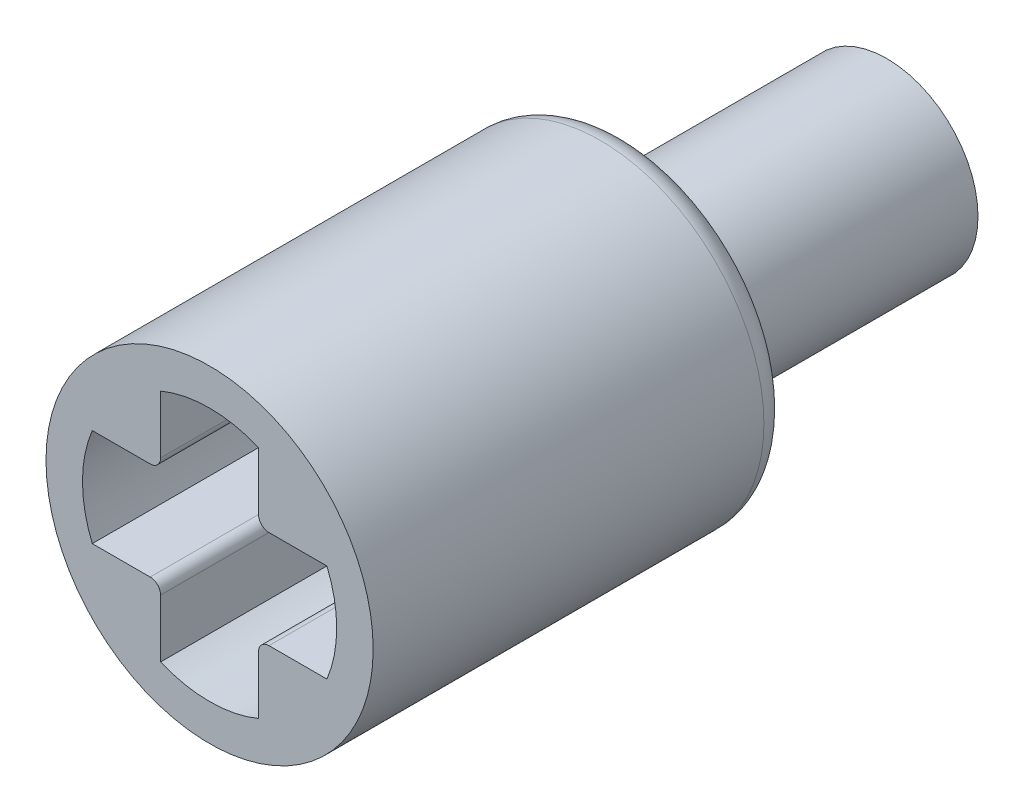
ISO-10303-21;
HEADER;
FILE_DESCRIPTION(('STEP AP214'),'2;1');
FILE_NAME('part.step','',(''),(''),'','','');
FILE_SCHEMA(('AUTOMOTIVE_DESIGN { 1 0 10303 214 1 1 1 1 }'));
ENDSEC;
DATA;
#1=APPLICATION_CONTEXT('core data for automotive mechanical design processes');
#2=APPLICATION_PROTOCOL_DEFINITION('international standard','automotive_design',2000,#1);
#3=PRODUCT_CONTEXT('',#1,'mechanical');
#4=PRODUCT('Part','Part','',(#3));
#5=PRODUCT_RELATED_PRODUCT_CATEGORY('part','',(#4));
#6=PRODUCT_DEFINITION_FORMATION('','',#4);
#7=PRODUCT_DEFINITION_CONTEXT('part definition',#1,'design');
#8=PRODUCT_DEFINITION('design','',#6,#7);
#9=PRODUCT_DEFINITION_SHAPE('','',#8);
#10=(LENGTH_UNIT() NAMED_UNIT(*) SI_UNIT(.MILLI.,.METRE.));
#11=(NAMED_UNIT(*) PLANE_ANGLE_UNIT() SI_UNIT($,.RADIAN.));
#12=(NAMED_UNIT(*) SI_UNIT($,.STERADIAN.) SOLID_ANGLE_UNIT());
#13=UNCERTAINTY_MEASURE_WITH_UNIT(LENGTH_MEASURE(1.E-05),#10,'distance_accuracy_value','');
#14=(GEOMETRIC_REPRESENTATION_CONTEXT(3) GLOBAL_UNCERTAINTY_ASSIGNED_CONTEXT((#13)) GLOBAL_UNIT_ASSIGNED_CONTEXT((#10,
#11,#12)) REPRESENTATION_CONTEXT('',''));
#15=CARTESIAN_POINT('',(0.,0.,0.));
#16=DIRECTION('',(0.,0.,1.));
#17=DIRECTION('',(1.,0.,0.));
#18=AXIS2_PLACEMENT_3D('',#15,#16,#17);
#19=CARTESIAN_POINT('',(0.,0.,0.));
#20=DIRECTION('',(0.,0.,1.));
#21=DIRECTION('',(1.,0.,0.));
#22=AXIS2_PLACEMENT_3D('',#19,#20,#21);
#23=PLANE('',#22);
#24=CARTESIAN_POINT('',(0.,0.,0.));
#25=DIRECTION('',(0.,0.,1.));
#26=DIRECTION('',(1.,0.,0.));
#27=AXIS2_PLACEMENT_3D('',#24,#25,#26);
#28=CIRCLE('',#27,1.75);
#29=CARTESIAN_POINT('',(1.75,0.,0.));
#30=VERTEX_POINT('',#29);
#31=EDGE_CURVE('E258',#30,#30,#28,.T.);
#32=ORIENTED_EDGE('',*,*,#31,.F.);
#33=EDGE_LOOP('',(#32));
#34=FACE_BOUND('',#33,.T.);
#35=CARTESIAN_POINT('',(0.,0.,0.));
#36=DIRECTION('',(0.,0.,1.));
#37=DIRECTION('',(1.,0.,0.));
#38=AXIS2_PLACEMENT_3D('',#35,#36,#37);
#39=CIRCLE('',#38,1.);
#40=CARTESIAN_POINT('',(1.,0.,0.));
#41=VERTEX_POINT('',#40);
#42=EDGE_CURVE('E255',#41,#41,#39,.T.);
#43=ORIENTED_EDGE('',*,*,#42,.T.);
#44=EDGE_LOOP('',(#43));
#45=FACE_BOUND('',#44,.T.);
#46=ADVANCED_FACE('F39',(#34,#45),#23,.F.);
#47=CARTESIAN_POINT('',(0.,0.,5.));
#48=DIRECTION('',(0.,0.,-1.));
#49=DIRECTION('',(-1.,0.,0.));
#50=AXIS2_PLACEMENT_3D('',#47,#48,#49);
#51=CYLINDRICAL_SURFACE('',#50,1.75);
#52=CARTESIAN_POINT('',(0.,0.,4.5));
#53=DIRECTION('',(0.,0.,1.));
#54=DIRECTION('',(1.,0.,0.));
#55=AXIS2_PLACEMENT_3D('',#52,#53,#54);
#56=CIRCLE('',#55,1.75);
#57=CARTESIAN_POINT('',(1.75,0.,4.5));
#58=VERTEX_POINT('',#57);
#59=EDGE_CURVE('E270',#58,#58,#56,.F.);
#60=ORIENTED_EDGE('',*,*,#59,.T.);
#61=EDGE_LOOP('',(#60));
#62=FACE_BOUND('',#61,.T.);
#63=ORIENTED_EDGE('',*,*,#31,.T.);
#64=EDGE_LOOP('',(#63));
#65=FACE_BOUND('',#64,.T.);
#66=ADVANCED_FACE('F364',(#62,#65),#51,.T.);
#67=CARTESIAN_POINT('',(0.,0.,5.));
#68=DIRECTION('',(0.,0.,-1.));
#69=DIRECTION('',(-1.,0.,0.));
#70=AXIS2_PLACEMENT_3D('',#67,#68,#69);
#71=CYLINDRICAL_SURFACE('',#70,1.);
#72=CARTESIAN_POINT('',(0.,0.,5.));
#73=DIRECTION('',(0.,0.,1.));
#74=DIRECTION('',(1.,0.,0.));
#75=AXIS2_PLACEMENT_3D('',#72,#73,#74);
#76=CIRCLE('',#75,1.);
#77=CARTESIAN_POINT('',(1.,0.,5.));
#78=VERTEX_POINT('',#77);
#79=EDGE_CURVE('E252',#78,#78,#76,.T.);
#80=ORIENTED_EDGE('',*,*,#79,.T.);
#81=EDGE_LOOP('',(#80));
#82=FACE_BOUND('',#81,.T.);
#83=ORIENTED_EDGE('',*,*,#42,.F.);
#84=EDGE_LOOP('',(#83));
#85=FACE_BOUND('',#84,.T.);
#86=ADVANCED_FACE('F370',(#82,#85),#71,.F.);
#87=CARTESIAN_POINT('',(0.,0.,5.));
#88=DIRECTION('',(0.,0.,1.));
#89=DIRECTION('',(1.,0.,0.));
#90=AXIS2_PLACEMENT_3D('',#87,#88,#89);
#91=PLANE('',#90);
#92=ORIENTED_EDGE('',*,*,#79,.F.);
#93=EDGE_LOOP('',(#92));
#94=FACE_BOUND('',#93,.T.);
#95=ADVANCED_FACE('F538',(#94),#91,.F.);
#96=CARTESIAN_POINT('',(0.,0.,6.));
#97=DIRECTION('',(0.,0.,-1.));
#98=DIRECTION('',(-1.,0.,0.));
#99=AXIS2_PLACEMENT_3D('',#96,#97,#98);
#100=CYLINDRICAL_SURFACE('',#99,3.14);
#101=CARTESIAN_POINT('',(0.,0.,5.5));
#102=DIRECTION('',(0.,0.,1.));
#103=DIRECTION('',(1.,0.,0.));
#104=AXIS2_PLACEMENT_3D('',#101,#102,#103);
#105=CIRCLE('',#104,3.14);
#106=CARTESIAN_POINT('',(3.14,0.,5.5));
#107=VERTEX_POINT('',#106);
#108=EDGE_CURVE('E261',#107,#107,#105,.T.);
#109=ORIENTED_EDGE('',*,*,#108,.T.);
#110=EDGE_LOOP('',(#109));
#111=FACE_BOUND('',#110,.T.);
#112=CARTESIAN_POINT('',(0.,0.,13.));
#113=DIRECTION('',(0.,0.,1.));
#114=DIRECTION('',(1.,0.,0.));
#115=AXIS2_PLACEMENT_3D('',#112,#113,#114);
#116=CIRCLE('',#115,3.14);
#117=CARTESIAN_POINT('',(3.14,0.,13.));
#118=VERTEX_POINT('',#117);
#119=EDGE_CURVE('E201',#118,#118,#116,.T.);
#120=ORIENTED_EDGE('',*,*,#119,.F.);
#121=EDGE_LOOP('',(#120));
#122=FACE_BOUND('',#121,.T.);
#123=ADVANCED_FACE('F535',(#111,#122),#100,.T.);
#124=CARTESIAN_POINT('',(0.,0.,5.));
#125=DIRECTION('',(0.,0.,1.));
#126=DIRECTION('',(1.,0.,0.));
#127=AXIS2_PLACEMENT_3D('',#124,#125,#126);
#128=CIRCLE('',#127,2.64);
#129=CARTESIAN_POINT('',(2.64,0.,5.));
#130=VERTEX_POINT('',#129);
#131=EDGE_CURVE('E267',#130,#130,#128,.F.);
#132=ORIENTED_EDGE('',*,*,#131,.T.);
#133=EDGE_LOOP('',(#132));
#134=FACE_BOUND('',#133,.T.);
#135=CARTESIAN_POINT('',(0.,0.,5.));
#136=DIRECTION('',(0.,0.,1.));
#137=DIRECTION('',(1.,0.,0.));
#138=AXIS2_PLACEMENT_3D('',#135,#136,#137);
#139=CIRCLE('',#138,2.25);
#140=CARTESIAN_POINT('',(2.25,0.,5.));
#141=VERTEX_POINT('',#140);
#142=EDGE_CURVE('E264',#141,#141,#139,.T.);
#143=ORIENTED_EDGE('',*,*,#142,.T.);
#144=EDGE_LOOP('',(#143));
#145=FACE_BOUND('',#144,.T.);
#146=ADVANCED_FACE('F531',(#134,#145),#91,.F.);
#147=CARTESIAN_POINT('',(0.,0.,13.));
#148=DIRECTION('',(0.,0.,-1.));
#149=DIRECTION('',(-1.,0.,0.));
#150=AXIS2_PLACEMENT_3D('',#147,#148,#149);
#151=CYLINDRICAL_SURFACE('',#150,2.44000000000001);
#152=DIRECTION('',(0.,0.,-1.));
#153=VECTOR('',#152,1.);
#154=CARTESIAN_POINT('',(0.940000000000001,-2.25166604983954,13.));
#155=LINE('',#154,#153);
#156=CARTESIAN_POINT('',(0.940000000000001,-2.25166604983954,13.));
#157=VERTEX_POINT('',#156);
#158=CARTESIAN_POINT('',(0.940000000000001,-2.25166604983954,6.));
#159=VERTEX_POINT('',#158);
#160=EDGE_CURVE('E204',#157,#159,#155,.T.);
#161=ORIENTED_EDGE('',*,*,#160,.T.);
#162=CARTESIAN_POINT('',(0.,0.,6.));
#163=DIRECTION('',(0.,0.,1.));
#164=DIRECTION('',(1.,0.,0.));
#165=AXIS2_PLACEMENT_3D('',#162,#163,#164);
#166=CIRCLE('',#165,2.44000000000001);
#167=CARTESIAN_POINT('',(-0.94,-2.25166604983954,6.));
#168=VERTEX_POINT('',#167);
#169=EDGE_CURVE('E158',#159,#168,#166,.F.);
#170=ORIENTED_EDGE('',*,*,#169,.T.);
#171=DIRECTION('',(0.,0.,-1.));
#172=VECTOR('',#171,1.);
#173=CARTESIAN_POINT('',(-0.94,-2.25166604983954,13.));
#174=LINE('',#173,#172);
#175=CARTESIAN_POINT('',(-0.94,-2.25166604983954,13.));
#176=VERTEX_POINT('',#175);
#177=EDGE_CURVE('E151',#176,#168,#174,.T.);
#178=ORIENTED_EDGE('',*,*,#177,.F.);
#179=CARTESIAN_POINT('',(0.,0.,13.));
#180=DIRECTION('',(0.,0.,1.));
#181=DIRECTION('',(1.,0.,0.));
#182=AXIS2_PLACEMENT_3D('',#179,#180,#181);
#183=CIRCLE('',#182,2.44000000000001);
#184=EDGE_CURVE('E156',#176,#157,#183,.T.);
#185=ORIENTED_EDGE('',*,*,#184,.T.);
#186=EDGE_LOOP('',(#161,#170,#178,#185));
#187=FACE_BOUND('',#186,.T.);
#188=ADVANCED_FACE('F154',(#187),#151,.F.);
#189=CARTESIAN_POINT('',(-0.94,0.,13.));
#190=DIRECTION('',(-1.,0.,0.));
#191=DIRECTION('',(0.,0.,1.));
#192=AXIS2_PLACEMENT_3D('',#189,#190,#191);
#193=PLANE('',#192);
#194=DIRECTION('',(0.,-1.,0.));
#195=VECTOR('',#194,1.);
#196=CARTESIAN_POINT('',(-0.94,0.,6.));
#197=LINE('',#196,#195);
#198=CARTESIAN_POINT('',(-0.94,-1.14000000000001,6.));
#199=VERTEX_POINT('',#198);
#200=EDGE_CURVE('E249',#199,#168,#197,.T.);
#201=ORIENTED_EDGE('',*,*,#200,.F.);
#202=DIRECTION('',(0.,0.,-1.));
#203=VECTOR('',#202,1.);
#204=CARTESIAN_POINT('',(-0.94,-1.14000000000001,13.));
#205=LINE('',#204,#203);
#206=CARTESIAN_POINT('',(-0.94,-1.14000000000001,13.));
#207=VERTEX_POINT('',#206);
#208=EDGE_CURVE('E166',#199,#207,#205,.F.);
#209=ORIENTED_EDGE('',*,*,#208,.T.);
#210=DIRECTION('',(0.,1.,0.));
#211=VECTOR('',#210,1.);
#212=CARTESIAN_POINT('',(-0.94,0.,13.));
#213=LINE('',#212,#211);
#214=EDGE_CURVE('E164',#176,#207,#213,.T.);
#215=ORIENTED_EDGE('',*,*,#214,.F.);
#216=ORIENTED_EDGE('',*,*,#177,.T.);
#217=EDGE_LOOP('',(#201,#209,#215,#216));
#218=FACE_BOUND('',#217,.T.);
#219=ADVANCED_FACE('F165',(#218),#193,.F.);
#220=CARTESIAN_POINT('',(0.,-0.940000000000009,13.));
#221=DIRECTION('',(0.,-1.,0.));
#222=DIRECTION('',(1.,0.,0.));
#223=AXIS2_PLACEMENT_3D('',#220,#221,#222);
#224=PLANE('',#223);
#225=DIRECTION('',(-1.,0.,0.));
#226=VECTOR('',#225,1.);
#227=CARTESIAN_POINT('',(0.,-0.940000000000009,13.));
#228=LINE('',#227,#226);
#229=CARTESIAN_POINT('',(-1.14,-0.940000000000009,13.));
#230=VERTEX_POINT('',#229);
#231=CARTESIAN_POINT('',(-2.25166604983954,-0.940000000000009,13.));
#232=VERTEX_POINT('',#231);
#233=EDGE_CURVE('E169',#230,#232,#228,.T.);
#234=ORIENTED_EDGE('',*,*,#233,.F.);
#235=DIRECTION('',(0.,0.,-1.));
#236=VECTOR('',#235,1.);
#237=CARTESIAN_POINT('',(-1.14,-0.940000000000009,13.));
#238=LINE('',#237,#236);
#239=CARTESIAN_POINT('',(-1.14,-0.940000000000009,6.));
#240=VERTEX_POINT('',#239);
#241=EDGE_CURVE('E296',#230,#240,#238,.T.);
#242=ORIENTED_EDGE('',*,*,#241,.T.);
#243=DIRECTION('',(1.,0.,0.));
#244=VECTOR('',#243,1.);
#245=CARTESIAN_POINT('',(0.,-0.940000000000009,6.));
#246=LINE('',#245,#244);
#247=CARTESIAN_POINT('',(-2.25166604983954,-0.940000000000009,6.));
#248=VERTEX_POINT('',#247);
#249=EDGE_CURVE('E247',#248,#240,#246,.T.);
#250=ORIENTED_EDGE('',*,*,#249,.F.);
#251=DIRECTION('',(0.,0.,-1.));
#252=VECTOR('',#251,1.);
#253=CARTESIAN_POINT('',(-2.25166604983954,-0.940000000000009,13.));
#254=LINE('',#253,#252);
#255=EDGE_CURVE('E161',#232,#248,#254,.T.);
#256=ORIENTED_EDGE('',*,*,#255,.F.);
#257=EDGE_LOOP('',(#234,#242,#250,#256));
#258=FACE_BOUND('',#257,.T.);
#259=ADVANCED_FACE('F320',(#258),#224,.F.);
#260=CARTESIAN_POINT('',(0.,0.,13.));
#261=DIRECTION('',(0.,0.,-1.));
#262=DIRECTION('',(-1.,0.,0.));
#263=AXIS2_PLACEMENT_3D('',#260,#261,#262);
#264=CYLINDRICAL_SURFACE('',#263,2.44);
#265=ORIENTED_EDGE('',*,*,#255,.T.);
#266=CARTESIAN_POINT('',(0.,0.,6.));
#267=DIRECTION('',(0.,0.,1.));
#268=DIRECTION('',(1.,0.,0.));
#269=AXIS2_PLACEMENT_3D('',#266,#267,#268);
#270=CIRCLE('',#269,2.44);
#271=CARTESIAN_POINT('',(-2.25166604983954,0.940000000000009,6.));
#272=VERTEX_POINT('',#271);
#273=EDGE_CURVE('E244',#248,#272,#270,.F.);
#274=ORIENTED_EDGE('',*,*,#273,.T.);
#275=DIRECTION('',(0.,0.,-1.));
#276=VECTOR('',#275,1.);
#277=CARTESIAN_POINT('',(-2.25166604983954,0.940000000000009,13.));
#278=LINE('',#277,#276);
#279=CARTESIAN_POINT('',(-2.25166604983954,0.940000000000009,13.));
#280=VERTEX_POINT('',#279);
#281=EDGE_CURVE('E218',#280,#272,#278,.T.);
#282=ORIENTED_EDGE('',*,*,#281,.F.);
#283=CARTESIAN_POINT('',(0.,0.,13.));
#284=DIRECTION('',(0.,0.,1.));
#285=DIRECTION('',(1.,0.,0.));
#286=AXIS2_PLACEMENT_3D('',#283,#284,#285);
#287=CIRCLE('',#286,2.44);
#288=EDGE_CURVE('E180',#280,#232,#287,.T.);
#289=ORIENTED_EDGE('',*,*,#288,.T.);
#290=EDGE_LOOP('',(#265,#274,#282,#289));
#291=FACE_BOUND('',#290,.T.);
#292=ADVANCED_FACE('F323',(#291),#264,.F.);
#293=CARTESIAN_POINT('',(0.,0.940000000000009,13.));
#294=DIRECTION('',(0.,1.,0.));
#295=DIRECTION('',(0.,0.,1.));
#296=AXIS2_PLACEMENT_3D('',#293,#294,#295);
#297=PLANE('',#296);
#298=DIRECTION('',(-1.,0.,0.));
#299=VECTOR('',#298,1.);
#300=CARTESIAN_POINT('',(0.,0.940000000000009,6.));
#301=LINE('',#300,#299);
#302=CARTESIAN_POINT('',(-1.14,0.940000000000009,6.));
#303=VERTEX_POINT('',#302);
#304=EDGE_CURVE('E242',#303,#272,#301,.T.);
#305=ORIENTED_EDGE('',*,*,#304,.F.);
#306=DIRECTION('',(0.,0.,-1.));
#307=VECTOR('',#306,1.);
#308=CARTESIAN_POINT('',(-1.14,0.940000000000009,13.));
#309=LINE('',#308,#307);
#310=CARTESIAN_POINT('',(-1.14,0.940000000000009,13.));
#311=VERTEX_POINT('',#310);
#312=EDGE_CURVE('E276',#303,#311,#309,.F.);
#313=ORIENTED_EDGE('',*,*,#312,.T.);
#314=DIRECTION('',(1.,0.,0.));
#315=VECTOR('',#314,1.);
#316=CARTESIAN_POINT('',(0.,0.940000000000009,13.));
#317=LINE('',#316,#315);
#318=EDGE_CURVE('E183',#280,#311,#317,.T.);
#319=ORIENTED_EDGE('',*,*,#318,.F.);
#320=ORIENTED_EDGE('',*,*,#281,.T.);
#321=EDGE_LOOP('',(#305,#313,#319,#320));
#322=FACE_BOUND('',#321,.T.);
#323=ADVANCED_FACE('F482',(#322),#297,.F.);
#324=CARTESIAN_POINT('',(-0.94,0.,13.));
#325=DIRECTION('',(-1.,0.,0.));
#326=DIRECTION('',(0.,-1.,0.));
#327=AXIS2_PLACEMENT_3D('',#324,#325,#326);
#328=PLANE('',#327);
#329=DIRECTION('',(0.,1.,0.));
#330=VECTOR('',#329,1.);
#331=CARTESIAN_POINT('',(-0.94,0.,13.));
#332=LINE('',#331,#330);
#333=CARTESIAN_POINT('',(-0.94,1.14000000000001,13.));
#334=VERTEX_POINT('',#333);
#335=CARTESIAN_POINT('',(-0.94,2.25166604983954,13.));
#336=VERTEX_POINT('',#335);
#337=EDGE_CURVE('E185',#334,#336,#332,.T.);
#338=ORIENTED_EDGE('',*,*,#337,.F.);
#339=DIRECTION('',(0.,0.,-1.));
#340=VECTOR('',#339,1.);
#341=CARTESIAN_POINT('',(-0.94,1.14000000000001,13.));
#342=LINE('',#341,#340);
#343=CARTESIAN_POINT('',(-0.94,1.14000000000001,6.));
#344=VERTEX_POINT('',#343);
#345=EDGE_CURVE('E273',#334,#344,#342,.T.);
#346=ORIENTED_EDGE('',*,*,#345,.T.);
#347=DIRECTION('',(0.,-1.,0.));
#348=VECTOR('',#347,1.);
#349=CARTESIAN_POINT('',(-0.94,0.,6.));
#350=LINE('',#349,#348);
#351=CARTESIAN_POINT('',(-0.94,2.25166604983954,6.));
#352=VERTEX_POINT('',#351);
#353=EDGE_CURVE('E239',#352,#344,#350,.T.);
#354=ORIENTED_EDGE('',*,*,#353,.F.);
#355=DIRECTION('',(0.,0.,-1.));
#356=VECTOR('',#355,1.);
#357=CARTESIAN_POINT('',(-0.94,2.25166604983954,13.));
#358=LINE('',#357,#356);
#359=EDGE_CURVE('E215',#336,#352,#358,.T.);
#360=ORIENTED_EDGE('',*,*,#359,.F.);
#361=EDGE_LOOP('',(#338,#346,#354,#360));
#362=FACE_BOUND('',#361,.T.);
#363=ADVANCED_FACE('F333',(#362),#328,.F.);
#364=CARTESIAN_POINT('',(0.,0.,13.));
#365=DIRECTION('',(0.,0.,-1.));
#366=DIRECTION('',(-1.,0.,0.));
#367=AXIS2_PLACEMENT_3D('',#364,#365,#366);
#368=CYLINDRICAL_SURFACE('',#367,2.44);
#369=CARTESIAN_POINT('',(0.,0.,6.));
#370=DIRECTION('',(0.,0.,1.));
#371=DIRECTION('',(1.,0.,0.));
#372=AXIS2_PLACEMENT_3D('',#369,#370,#371);
#373=CIRCLE('',#372,2.44);
#374=CARTESIAN_POINT('',(0.94,2.25166604983954,6.));
#375=VERTEX_POINT('',#374);
#376=EDGE_CURVE('E236',#375,#352,#373,.T.);
#377=ORIENTED_EDGE('',*,*,#376,.F.);
#378=DIRECTION('',(0.,0.,-1.));
#379=VECTOR('',#378,1.);
#380=CARTESIAN_POINT('',(0.94,2.25166604983954,13.));
#381=LINE('',#380,#379);
#382=CARTESIAN_POINT('',(0.94,2.25166604983954,13.));
#383=VERTEX_POINT('',#382);
#384=EDGE_CURVE('E212',#383,#375,#381,.T.);
#385=ORIENTED_EDGE('',*,*,#384,.F.);
#386=CARTESIAN_POINT('',(0.,0.,13.));
#387=DIRECTION('',(0.,0.,1.));
#388=DIRECTION('',(1.,0.,0.));
#389=AXIS2_PLACEMENT_3D('',#386,#387,#388);
#390=CIRCLE('',#389,2.44);
#391=EDGE_CURVE('E187',#336,#383,#390,.F.);
#392=ORIENTED_EDGE('',*,*,#391,.F.);
#393=ORIENTED_EDGE('',*,*,#359,.T.);
#394=EDGE_LOOP('',(#377,#385,#392,#393));
#395=FACE_BOUND('',#394,.T.);
#396=ADVANCED_FACE('F339',(#395),#368,.F.);
#397=CARTESIAN_POINT('',(0.94,0.,13.));
#398=DIRECTION('',(-1.,0.,0.));
#399=DIRECTION('',(0.,0.,1.));
#400=AXIS2_PLACEMENT_3D('',#397,#398,#399);
#401=PLANE('',#400);
#402=DIRECTION('',(0.,-1.,0.));
#403=VECTOR('',#402,1.);
#404=CARTESIAN_POINT('',(0.94,0.,6.));
#405=LINE('',#404,#403);
#406=CARTESIAN_POINT('',(0.94,1.14,6.));
#407=VERTEX_POINT('',#406);
#408=EDGE_CURVE('E233',#375,#407,#405,.T.);
#409=ORIENTED_EDGE('',*,*,#408,.T.);
#410=DIRECTION('',(0.,0.,-1.));
#411=VECTOR('',#410,1.);
#412=CARTESIAN_POINT('',(0.94,1.14,13.));
#413=LINE('',#412,#411);
#414=CARTESIAN_POINT('',(0.94,1.14,13.));
#415=VERTEX_POINT('',#414);
#416=EDGE_CURVE('E289',#407,#415,#413,.F.);
#417=ORIENTED_EDGE('',*,*,#416,.T.);
#418=DIRECTION('',(0.,1.,0.));
#419=VECTOR('',#418,1.);
#420=CARTESIAN_POINT('',(0.94,0.,13.));
#421=LINE('',#420,#419);
#422=EDGE_CURVE('E190',#415,#383,#421,.T.);
#423=ORIENTED_EDGE('',*,*,#422,.T.);
#424=ORIENTED_EDGE('',*,*,#384,.T.);
#425=EDGE_LOOP('',(#409,#417,#423,#424));
#426=FACE_BOUND('',#425,.T.);
#427=ADVANCED_FACE('F342',(#426),#401,.T.);
#428=CARTESIAN_POINT('',(0.,0.940000000000003,13.));
#429=DIRECTION('',(0.,1.,0.));
#430=DIRECTION('',(0.,0.,1.));
#431=AXIS2_PLACEMENT_3D('',#428,#429,#430);
#432=PLANE('',#431);
#433=DIRECTION('',(1.,0.,0.));
#434=VECTOR('',#433,1.);
#435=CARTESIAN_POINT('',(0.,0.940000000000003,13.));
#436=LINE('',#435,#434);
#437=CARTESIAN_POINT('',(1.14,0.940000000000003,13.));
#438=VERTEX_POINT('',#437);
#439=CARTESIAN_POINT('',(2.25166604983952,0.940000000000003,13.));
#440=VERTEX_POINT('',#439);
#441=EDGE_CURVE('E192',#438,#440,#436,.T.);
#442=ORIENTED_EDGE('',*,*,#441,.F.);
#443=DIRECTION('',(0.,0.,-1.));
#444=VECTOR('',#443,1.);
#445=CARTESIAN_POINT('',(1.14,0.940000000000003,6.));
#446=LINE('',#445,#444);
#447=CARTESIAN_POINT('',(1.14,0.940000000000003,6.));
#448=VERTEX_POINT('',#447);
#449=EDGE_CURVE('E286',#438,#448,#446,.T.);
#450=ORIENTED_EDGE('',*,*,#449,.T.);
#451=DIRECTION('',(-1.,0.,0.));
#452=VECTOR('',#451,1.);
#453=CARTESIAN_POINT('',(0.,0.940000000000003,6.));
#454=LINE('',#453,#452);
#455=CARTESIAN_POINT('',(2.25166604983952,0.940000000000003,6.));
#456=VERTEX_POINT('',#455);
#457=EDGE_CURVE('E230',#456,#448,#454,.T.);
#458=ORIENTED_EDGE('',*,*,#457,.F.);
#459=DIRECTION('',(0.,0.,-1.));
#460=VECTOR('',#459,1.);
#461=CARTESIAN_POINT('',(2.25166604983952,0.940000000000003,13.));
#462=LINE('',#461,#460);
#463=EDGE_CURVE('E209',#440,#456,#462,.T.);
#464=ORIENTED_EDGE('',*,*,#463,.F.);
#465=EDGE_LOOP('',(#442,#450,#458,#464));
#466=FACE_BOUND('',#465,.T.);
#467=ADVANCED_FACE('F351',(#466),#432,.F.);
#468=CARTESIAN_POINT('',(0.,0.,13.));
#469=DIRECTION('',(0.,0.,-1.));
#470=DIRECTION('',(-1.,0.,0.));
#471=AXIS2_PLACEMENT_3D('',#468,#469,#470);
#472=CYLINDRICAL_SURFACE('',#471,2.44);
#473=ORIENTED_EDGE('',*,*,#463,.T.);
#474=CARTESIAN_POINT('',(0.,0.,6.));
#475=DIRECTION('',(0.,0.,1.));
#476=DIRECTION('',(1.,0.,0.));
#477=AXIS2_PLACEMENT_3D('',#474,#475,#476);
#478=CIRCLE('',#477,2.44);
#479=CARTESIAN_POINT('',(2.25166604983952,-0.940000000000003,6.));
#480=VERTEX_POINT('',#479);
#481=EDGE_CURVE('E227',#456,#480,#478,.F.);
#482=ORIENTED_EDGE('',*,*,#481,.T.);
#483=DIRECTION('',(0.,0.,-1.));
#484=VECTOR('',#483,1.);
#485=CARTESIAN_POINT('',(2.25166604983952,-0.940000000000003,13.));
#486=LINE('',#485,#484);
#487=CARTESIAN_POINT('',(2.25166604983952,-0.940000000000003,13.));
#488=VERTEX_POINT('',#487);
#489=EDGE_CURVE('E206',#488,#480,#486,.T.);
#490=ORIENTED_EDGE('',*,*,#489,.F.);
#491=CARTESIAN_POINT('',(0.,0.,13.));
#492=DIRECTION('',(0.,0.,1.));
#493=DIRECTION('',(1.,0.,0.));
#494=AXIS2_PLACEMENT_3D('',#491,#492,#493);
#495=CIRCLE('',#494,2.44);
#496=EDGE_CURVE('E194',#488,#440,#495,.T.);
#497=ORIENTED_EDGE('',*,*,#496,.T.);
#498=EDGE_LOOP('',(#473,#482,#490,#497));
#499=FACE_BOUND('',#498,.T.);
#500=ADVANCED_FACE('F354',(#499),#472,.F.);
#501=CARTESIAN_POINT('',(0.,-0.940000000000003,13.));
#502=DIRECTION('',(0.,-1.,0.));
#503=DIRECTION('',(0.,0.,-1.));
#504=AXIS2_PLACEMENT_3D('',#501,#502,#503);
#505=PLANE('',#504);
#506=DIRECTION('',(1.,0.,0.));
#507=VECTOR('',#506,1.);
#508=CARTESIAN_POINT('',(0.,-0.940000000000003,6.));
#509=LINE('',#508,#507);
#510=CARTESIAN_POINT('',(1.14,-0.940000000000003,6.));
#511=VERTEX_POINT('',#510);
#512=EDGE_CURVE('E225',#511,#480,#509,.T.);
#513=ORIENTED_EDGE('',*,*,#512,.F.);
#514=DIRECTION('',(0.,0.,-1.));
#515=VECTOR('',#514,1.);
#516=CARTESIAN_POINT('',(1.14,-0.940000000000003,13.));
#517=LINE('',#516,#515);
#518=CARTESIAN_POINT('',(1.14,-0.940000000000003,13.));
#519=VERTEX_POINT('',#518);
#520=EDGE_CURVE('E294',#511,#519,#517,.F.);
#521=ORIENTED_EDGE('',*,*,#520,.T.);
#522=DIRECTION('',(-1.,0.,0.));
#523=VECTOR('',#522,1.);
#524=CARTESIAN_POINT('',(0.,-0.940000000000003,13.));
#525=LINE('',#524,#523);
#526=EDGE_CURVE('E197',#488,#519,#525,.T.);
#527=ORIENTED_EDGE('',*,*,#526,.F.);
#528=ORIENTED_EDGE('',*,*,#489,.T.);
#529=EDGE_LOOP('',(#513,#521,#527,#528));
#530=FACE_BOUND('',#529,.T.);
#531=ADVANCED_FACE('F309',(#530),#505,.F.);
#532=CARTESIAN_POINT('',(0.940000000000001,0.,13.));
#533=DIRECTION('',(1.,0.,0.));
#534=DIRECTION('',(0.,0.,-1.));
#535=AXIS2_PLACEMENT_3D('',#532,#533,#534);
#536=PLANE('',#535);
#537=DIRECTION('',(0.,-1.,0.));
#538=VECTOR('',#537,1.);
#539=CARTESIAN_POINT('',(0.940000000000001,0.,13.));
#540=LINE('',#539,#538);
#541=CARTESIAN_POINT('',(0.940000000000001,-1.14,13.));
#542=VERTEX_POINT('',#541);
#543=EDGE_CURVE('E175',#542,#157,#540,.T.);
#544=ORIENTED_EDGE('',*,*,#543,.F.);
#545=DIRECTION('',(0.,0.,-1.));
#546=VECTOR('',#545,1.);
#547=CARTESIAN_POINT('',(0.940000000000001,-1.14,13.));
#548=LINE('',#547,#546);
#549=CARTESIAN_POINT('',(0.940000000000001,-1.14,6.));
#550=VERTEX_POINT('',#549);
#551=EDGE_CURVE('E291',#542,#550,#548,.T.);
#552=ORIENTED_EDGE('',*,*,#551,.T.);
#553=DIRECTION('',(0.,1.,0.));
#554=VECTOR('',#553,1.);
#555=CARTESIAN_POINT('',(0.940000000000001,0.,6.));
#556=LINE('',#555,#554);
#557=EDGE_CURVE('E160',#159,#550,#556,.T.);
#558=ORIENTED_EDGE('',*,*,#557,.F.);
#559=ORIENTED_EDGE('',*,*,#160,.F.);
#560=EDGE_LOOP('',(#544,#552,#558,#559));
#561=FACE_BOUND('',#560,.T.);
#562=ADVANCED_FACE('F315',(#561),#536,.F.);
#563=CARTESIAN_POINT('',(0.,0.,13.));
#564=DIRECTION('',(0.,0.,1.));
#565=DIRECTION('',(1.,0.,0.));
#566=AXIS2_PLACEMENT_3D('',#563,#564,#565);
#567=PLANE('',#566);
#568=ORIENTED_EDGE('',*,*,#318,.T.);
#569=CARTESIAN_POINT('',(-1.14,1.14000000000001,13.));
#570=DIRECTION('',(0.,0.,1.));
#571=DIRECTION('',(1.,0.,0.));
#572=AXIS2_PLACEMENT_3D('',#569,#570,#571);
#573=CIRCLE('',#572,0.2);
#574=EDGE_CURVE('E284',#311,#334,#573,.T.);
#575=ORIENTED_EDGE('',*,*,#574,.T.);
#576=ORIENTED_EDGE('',*,*,#337,.T.);
#577=ORIENTED_EDGE('',*,*,#391,.T.);
#578=ORIENTED_EDGE('',*,*,#422,.F.);
#579=CARTESIAN_POINT('',(1.14,1.14,13.));
#580=DIRECTION('',(0.,0.,1.));
#581=DIRECTION('',(1.,0.,0.));
#582=AXIS2_PLACEMENT_3D('',#579,#580,#581);
#583=CIRCLE('',#582,0.2);
#584=EDGE_CURVE('E282',#415,#438,#583,.T.);
#585=ORIENTED_EDGE('',*,*,#584,.T.);
#586=ORIENTED_EDGE('',*,*,#441,.T.);
#587=ORIENTED_EDGE('',*,*,#496,.F.);
#588=ORIENTED_EDGE('',*,*,#526,.T.);
#589=CARTESIAN_POINT('',(1.14,-1.14,13.));
#590=DIRECTION('',(0.,0.,1.));
#591=DIRECTION('',(1.,0.,0.));
#592=AXIS2_PLACEMENT_3D('',#589,#590,#591);
#593=CIRCLE('',#592,0.2);
#594=EDGE_CURVE('E280',#519,#542,#593,.T.);
#595=ORIENTED_EDGE('',*,*,#594,.T.);
#596=ORIENTED_EDGE('',*,*,#543,.T.);
#597=ORIENTED_EDGE('',*,*,#184,.F.);
#598=ORIENTED_EDGE('',*,*,#214,.T.);
#599=CARTESIAN_POINT('',(-1.14,-1.14000000000001,13.));
#600=DIRECTION('',(0.,0.,1.));
#601=DIRECTION('',(1.,0.,0.));
#602=AXIS2_PLACEMENT_3D('',#599,#600,#601);
#603=CIRCLE('',#602,0.2);
#604=EDGE_CURVE('E278',#207,#230,#603,.T.);
#605=ORIENTED_EDGE('',*,*,#604,.T.);
#606=ORIENTED_EDGE('',*,*,#233,.T.);
#607=ORIENTED_EDGE('',*,*,#288,.F.);
#608=EDGE_LOOP('',(#568,#575,#576,#577,#578,#585,#586,#587,#588,#595,#596,#597,#598,#605,#606,#607));
#609=FACE_BOUND('',#608,.T.);
#610=ORIENTED_EDGE('',*,*,#119,.T.);
#611=EDGE_LOOP('',(#610));
#612=FACE_BOUND('',#611,.T.);
#613=ADVANCED_FACE('F172',(#609,#612),#567,.T.);
#614=CARTESIAN_POINT('',(0.,0.,6.));
#615=DIRECTION('',(0.,0.,1.));
#616=DIRECTION('',(1.,0.,0.));
#617=AXIS2_PLACEMENT_3D('',#614,#615,#616);
#618=PLANE('',#617);
#619=ORIENTED_EDGE('',*,*,#169,.F.);
#620=ORIENTED_EDGE('',*,*,#557,.T.);
#621=CARTESIAN_POINT('',(1.14,-1.14,6.));
#622=DIRECTION('',(0.,0.,1.));
#623=DIRECTION('',(1.,0.,0.));
#624=AXIS2_PLACEMENT_3D('',#621,#622,#623);
#625=CIRCLE('',#624,0.2);
#626=EDGE_CURVE('E47',#550,#511,#625,.F.);
#627=ORIENTED_EDGE('',*,*,#626,.T.);
#628=ORIENTED_EDGE('',*,*,#512,.T.);
#629=ORIENTED_EDGE('',*,*,#481,.F.);
#630=ORIENTED_EDGE('',*,*,#457,.T.);
#631=CARTESIAN_POINT('',(1.14,1.14,6.));
#632=DIRECTION('',(0.,0.,1.));
#633=DIRECTION('',(1.,0.,0.));
#634=AXIS2_PLACEMENT_3D('',#631,#632,#633);
#635=CIRCLE('',#634,0.2);
#636=EDGE_CURVE('E301',#448,#407,#635,.F.);
#637=ORIENTED_EDGE('',*,*,#636,.T.);
#638=ORIENTED_EDGE('',*,*,#408,.F.);
#639=ORIENTED_EDGE('',*,*,#376,.T.);
#640=ORIENTED_EDGE('',*,*,#353,.T.);
#641=CARTESIAN_POINT('',(-1.14,1.14000000000001,6.));
#642=DIRECTION('',(0.,0.,1.));
#643=DIRECTION('',(1.,0.,0.));
#644=AXIS2_PLACEMENT_3D('',#641,#642,#643);
#645=CIRCLE('',#644,0.2);
#646=EDGE_CURVE('E299',#344,#303,#645,.F.);
#647=ORIENTED_EDGE('',*,*,#646,.T.);
#648=ORIENTED_EDGE('',*,*,#304,.T.);
#649=ORIENTED_EDGE('',*,*,#273,.F.);
#650=ORIENTED_EDGE('',*,*,#249,.T.);
#651=CARTESIAN_POINT('',(-1.14,-1.14000000000001,6.));
#652=DIRECTION('',(0.,0.,1.));
#653=DIRECTION('',(1.,0.,0.));
#654=AXIS2_PLACEMENT_3D('',#651,#652,#653);
#655=CIRCLE('',#654,0.2);
#656=EDGE_CURVE('E11',#240,#199,#655,.F.);
#657=ORIENTED_EDGE('',*,*,#656,.T.);
#658=ORIENTED_EDGE('',*,*,#200,.T.);
#659=EDGE_LOOP('',(#619,#620,#627,#628,#629,#630,#637,#638,#639,#640,#647,#648,#649,#650,#657,#658));
#660=FACE_BOUND('',#659,.T.);
#661=ADVANCED_FACE('F303',(#660),#618,.T.);
#662=CARTESIAN_POINT('',(0.,0.,5.5));
#663=DIRECTION('',(0.,0.,1.));
#664=DIRECTION('',(1.,0.,0.));
#665=AXIS2_PLACEMENT_3D('',#662,#663,#664);
#666=TOROIDAL_SURFACE('',#665,2.64,0.5);
#667=ORIENTED_EDGE('',*,*,#131,.F.);
#668=EDGE_LOOP('',(#667));
#669=FACE_BOUND('',#668,.T.);
#670=ORIENTED_EDGE('',*,*,#108,.F.);
#671=EDGE_LOOP('',(#670));
#672=FACE_BOUND('',#671,.T.);
#673=ADVANCED_FACE('F378',(#669,#672),#666,.T.);
#674=CARTESIAN_POINT('',(0.,0.,4.5));
#675=DIRECTION('',(0.,0.,1.));
#676=DIRECTION('',(1.,0.,0.));
#677=AXIS2_PLACEMENT_3D('',#674,#675,#676);
#678=TOROIDAL_SURFACE('',#677,2.25,0.5);
#679=ORIENTED_EDGE('',*,*,#59,.F.);
#680=EDGE_LOOP('',(#679));
#681=FACE_BOUND('',#680,.T.);
#682=ORIENTED_EDGE('',*,*,#142,.F.);
#683=EDGE_LOOP('',(#682));
#684=FACE_BOUND('',#683,.T.);
#685=ADVANCED_FACE('F381',(#681,#684),#678,.F.);
#686=CARTESIAN_POINT('',(-1.14,1.14000000000001,13.));
#687=DIRECTION('',(0.,0.,-1.));
#688=DIRECTION('',(-1.,0.,0.));
#689=AXIS2_PLACEMENT_3D('',#686,#687,#688);
#690=CYLINDRICAL_SURFACE('',#689,0.2);
#691=ORIENTED_EDGE('',*,*,#574,.F.);
#692=ORIENTED_EDGE('',*,*,#312,.F.);
#693=ORIENTED_EDGE('',*,*,#646,.F.);
#694=ORIENTED_EDGE('',*,*,#345,.F.);
#695=EDGE_LOOP('',(#691,#692,#693,#694));
#696=FACE_BOUND('',#695,.T.);
#697=ADVANCED_FACE('F331',(#696),#690,.T.);
#698=CARTESIAN_POINT('',(1.14,1.14,13.));
#699=DIRECTION('',(0.,0.,1.));
#700=DIRECTION('',(1.,0.,0.));
#701=AXIS2_PLACEMENT_3D('',#698,#699,#700);
#702=CYLINDRICAL_SURFACE('',#701,0.2);
#703=ORIENTED_EDGE('',*,*,#584,.F.);
#704=ORIENTED_EDGE('',*,*,#416,.F.);
#705=ORIENTED_EDGE('',*,*,#636,.F.);
#706=ORIENTED_EDGE('',*,*,#449,.F.);
#707=EDGE_LOOP('',(#703,#704,#705,#706));
#708=FACE_BOUND('',#707,.T.);
#709=ADVANCED_FACE('F349',(#708),#702,.T.);
#710=CARTESIAN_POINT('',(1.14,-1.14,13.));
#711=DIRECTION('',(0.,0.,-1.));
#712=DIRECTION('',(-1.,0.,0.));
#713=AXIS2_PLACEMENT_3D('',#710,#711,#712);
#714=CYLINDRICAL_SURFACE('',#713,0.2);
#715=ORIENTED_EDGE('',*,*,#594,.F.);
#716=ORIENTED_EDGE('',*,*,#520,.F.);
#717=ORIENTED_EDGE('',*,*,#626,.F.);
#718=ORIENTED_EDGE('',*,*,#551,.F.);
#719=EDGE_LOOP('',(#715,#716,#717,#718));
#720=FACE_BOUND('',#719,.T.);
#721=ADVANCED_FACE('F312',(#720),#714,.T.);
#722=CARTESIAN_POINT('',(-1.14,-1.14000000000001,13.));
#723=DIRECTION('',(0.,0.,-1.));
#724=DIRECTION('',(-1.,0.,0.));
#725=AXIS2_PLACEMENT_3D('',#722,#723,#724);
#726=CYLINDRICAL_SURFACE('',#725,0.2);
#727=ORIENTED_EDGE('',*,*,#604,.F.);
#728=ORIENTED_EDGE('',*,*,#208,.F.);
#729=ORIENTED_EDGE('',*,*,#656,.F.);
#730=ORIENTED_EDGE('',*,*,#241,.F.);
#731=EDGE_LOOP('',(#727,#728,#729,#730));
#732=FACE_BOUND('',#731,.T.);
#733=ADVANCED_FACE('F41',(#732),#726,.T.);
#734=CLOSED_SHELL('',(#46,#66,#86,#95,#123,#146,#188,#219,#259,#292,#323,#363,#396,#427,#467,
#500,#531,#562,#613,#661,#673,#685,#697,#709,#721,#733));
#735=MANIFOLD_SOLID_BREP('B2',#734);
#736=ADVANCED_BREP_SHAPE_REPRESENTATION('',(#18,#735),#14);
#737=SHAPE_DEFINITION_REPRESENTATION(#9,#736);
ENDSEC;
END-ISO-10303-21;
